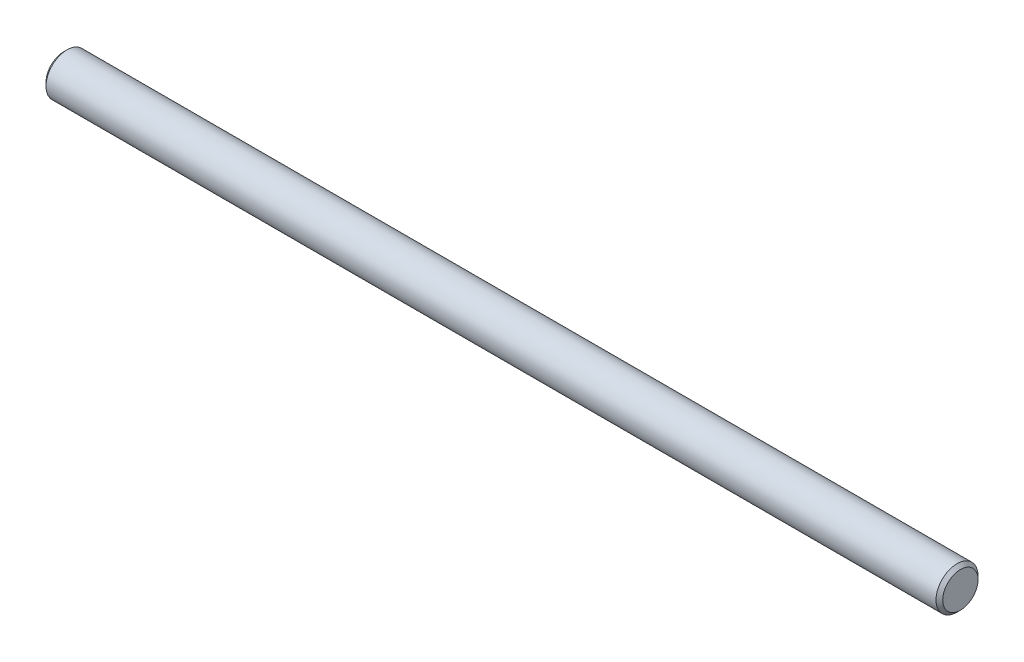
ISO-10303-21;
HEADER;
FILE_DESCRIPTION(('STEP AP214'),'2;1');
FILE_NAME('part.step','',(''),(''),'','','');
FILE_SCHEMA(('AUTOMOTIVE_DESIGN { 1 0 10303 214 1 1 1 1 }'));
ENDSEC;
DATA;
#1=APPLICATION_CONTEXT('core data for automotive mechanical design processes');
#2=APPLICATION_PROTOCOL_DEFINITION('international standard','automotive_design',2000,#1);
#3=PRODUCT_CONTEXT('',#1,'mechanical');
#4=PRODUCT('Part','Part','',(#3));
#5=PRODUCT_RELATED_PRODUCT_CATEGORY('part','',(#4));
#6=PRODUCT_DEFINITION_FORMATION('','',#4);
#7=PRODUCT_DEFINITION_CONTEXT('part definition',#1,'design');
#8=PRODUCT_DEFINITION('design','',#6,#7);
#9=PRODUCT_DEFINITION_SHAPE('','',#8);
#10=(LENGTH_UNIT() NAMED_UNIT(*) SI_UNIT(.MILLI.,.METRE.));
#11=(NAMED_UNIT(*) PLANE_ANGLE_UNIT() SI_UNIT($,.RADIAN.));
#12=(NAMED_UNIT(*) SI_UNIT($,.STERADIAN.) SOLID_ANGLE_UNIT());
#13=UNCERTAINTY_MEASURE_WITH_UNIT(LENGTH_MEASURE(1.E-05),#10,'distance_accuracy_value','');
#14=(GEOMETRIC_REPRESENTATION_CONTEXT(3) GLOBAL_UNCERTAINTY_ASSIGNED_CONTEXT((#13)) GLOBAL_UNIT_ASSIGNED_CONTEXT((#10,
#11,#12)) REPRESENTATION_CONTEXT('',''));
#15=CARTESIAN_POINT('',(0.,0.,0.));
#16=DIRECTION('',(0.,0.,1.));
#17=DIRECTION('',(1.,0.,0.));
#18=AXIS2_PLACEMENT_3D('',#15,#16,#17);
#19=CARTESIAN_POINT('',(101.6,0.,0.));
#20=DIRECTION('',(-1.,0.,0.));
#21=DIRECTION('',(0.,0.,1.));
#22=AXIS2_PLACEMENT_3D('',#19,#20,#21);
#23=CYLINDRICAL_SURFACE('',#22,2.38125);
#24=CARTESIAN_POINT('',(101.219,0.,0.));
#25=DIRECTION('',(1.,0.,0.));
#26=DIRECTION('',(0.,0.,-1.));
#27=AXIS2_PLACEMENT_3D('',#24,#25,#26);
#28=CIRCLE('',#27,2.38125);
#29=CARTESIAN_POINT('',(101.219,0.,2.38125000000001));
#30=VERTEX_POINT('',#29);
#31=EDGE_CURVE('E38',#30,#30,#28,.F.);
#32=ORIENTED_EDGE('',*,*,#31,.T.);
#33=EDGE_LOOP('',(#32));
#34=FACE_BOUND('',#33,.T.);
#35=CARTESIAN_POINT('',(0.380999999999992,0.,0.));
#36=DIRECTION('',(1.,0.,0.));
#37=DIRECTION('',(0.,0.,-1.));
#38=AXIS2_PLACEMENT_3D('',#35,#36,#37);
#39=CIRCLE('',#38,2.38125);
#40=CARTESIAN_POINT('',(0.380999999999992,0.,-2.38125));
#41=VERTEX_POINT('',#40);
#42=EDGE_CURVE('E42',#41,#41,#39,.T.);
#43=ORIENTED_EDGE('',*,*,#42,.T.);
#44=EDGE_LOOP('',(#43));
#45=FACE_BOUND('',#44,.T.);
#46=ADVANCED_FACE('F32',(#34,#45),#23,.T.);
#47=CARTESIAN_POINT('',(101.6,0.,0.));
#48=DIRECTION('',(1.,0.,0.));
#49=DIRECTION('',(0.,0.,-1.));
#50=AXIS2_PLACEMENT_3D('',#47,#48,#49);
#51=PLANE('',#50);
#52=CARTESIAN_POINT('',(101.6,0.,0.));
#53=DIRECTION('',(1.,0.,0.));
#54=DIRECTION('',(0.,0.,-1.));
#55=AXIS2_PLACEMENT_3D('',#52,#53,#54);
#56=CIRCLE('',#55,2.00024999999999);
#57=CARTESIAN_POINT('',(101.6,0.,2.00025));
#58=VERTEX_POINT('',#57);
#59=EDGE_CURVE('E46',#58,#58,#56,.T.);
#60=ORIENTED_EDGE('',*,*,#59,.T.);
#61=EDGE_LOOP('',(#60));
#62=FACE_BOUND('',#61,.T.);
#63=ADVANCED_FACE('F52',(#62),#51,.T.);
#64=CARTESIAN_POINT('',(0.,0.,0.));
#65=DIRECTION('',(1.,0.,0.));
#66=DIRECTION('',(0.,0.,-1.));
#67=AXIS2_PLACEMENT_3D('',#64,#65,#66);
#68=PLANE('',#67);
#69=CARTESIAN_POINT('',(0.,0.,0.));
#70=DIRECTION('',(1.,0.,0.));
#71=DIRECTION('',(0.,0.,-1.));
#72=AXIS2_PLACEMENT_3D('',#69,#70,#71);
#73=CIRCLE('',#72,2.00025000000001);
#74=CARTESIAN_POINT('',(0.,0.,-2.00025000000001));
#75=VERTEX_POINT('',#74);
#76=EDGE_CURVE('E10',#75,#75,#73,.F.);
#77=ORIENTED_EDGE('',*,*,#76,.T.);
#78=EDGE_LOOP('',(#77));
#79=FACE_BOUND('',#78,.T.);
#80=ADVANCED_FACE('F57',(#79),#68,.F.);
#81=CARTESIAN_POINT('',(101.6,0.,0.));
#82=DIRECTION('',(-1.,0.,0.));
#83=DIRECTION('',(0.,0.,1.));
#84=AXIS2_PLACEMENT_3D('',#81,#82,#83);
#85=CONICAL_SURFACE('',#84,2.00024999999999,0.785398163397448);
#86=CARTESIAN_POINT('',(101.219,0.,2.38125000000001));
#87=CARTESIAN_POINT('',(101.22296875,0.,2.37728125000001));
#88=CARTESIAN_POINT('',(101.2269375,0.,2.37331250000001));
#89=CARTESIAN_POINT('',(101.234875,0.,2.36537500000001));
#90=CARTESIAN_POINT('',(101.23884375,0.,2.36140625000001));
#91=CARTESIAN_POINT('',(101.24678125,0.,2.35346875000001));
#92=CARTESIAN_POINT('',(101.25075,0.,2.34950000000001));
#93=CARTESIAN_POINT('',(101.2586875,0.,2.34156250000001));
#94=CARTESIAN_POINT('',(101.26265625,0.,2.33759375000001));
#95=CARTESIAN_POINT('',(101.27059375,0.,2.32965625000001));
#96=CARTESIAN_POINT('',(101.2745625,0.,2.32568750000001));
#97=CARTESIAN_POINT('',(101.2825,0.,2.31775000000001));
#98=CARTESIAN_POINT('',(101.28646875,0.,2.31378125000001));
#99=CARTESIAN_POINT('',(101.29440625,0.,2.30584375000001));
#100=CARTESIAN_POINT('',(101.298375,0.,2.30187500000001));
#101=CARTESIAN_POINT('',(101.3063125,0.,2.29393750000001));
#102=CARTESIAN_POINT('',(101.31028125,0.,2.28996875000001));
#103=CARTESIAN_POINT('',(101.31821875,0.,2.28203125000001));
#104=CARTESIAN_POINT('',(101.3221875,0.,2.27806250000001));
#105=CARTESIAN_POINT('',(101.330125,0.,2.270125));
#106=CARTESIAN_POINT('',(101.33409375,0.,2.26615625));
#107=CARTESIAN_POINT('',(101.34203125,0.,2.25821875));
#108=CARTESIAN_POINT('',(101.346,0.,2.25425000000001));
#109=CARTESIAN_POINT('',(101.3539375,0.,2.24631250000001));
#110=CARTESIAN_POINT('',(101.35790625,0.,2.24234375));
#111=CARTESIAN_POINT('',(101.36584375,0.,2.23440625));
#112=CARTESIAN_POINT('',(101.3698125,0.,2.2304375));
#113=CARTESIAN_POINT('',(101.37775,0.,2.2225));
#114=CARTESIAN_POINT('',(101.38171875,0.,2.21853125));
#115=CARTESIAN_POINT('',(101.38965625,0.,2.21059375));
#116=CARTESIAN_POINT('',(101.393625,0.,2.206625));
#117=CARTESIAN_POINT('',(101.4015625,0.,2.1986875));
#118=CARTESIAN_POINT('',(101.40553125,0.,2.19471875));
#119=CARTESIAN_POINT('',(101.41346875,0.,2.18678125));
#120=CARTESIAN_POINT('',(101.4174375,0.,2.1828125));
#121=CARTESIAN_POINT('',(101.425375,0.,2.174875));
#122=CARTESIAN_POINT('',(101.42934375,0.,2.17090625));
#123=CARTESIAN_POINT('',(101.43728125,0.,2.16296875));
#124=CARTESIAN_POINT('',(101.44125,0.,2.159));
#125=CARTESIAN_POINT('',(101.4491875,0.,2.1510625));
#126=CARTESIAN_POINT('',(101.45315625,0.,2.14709375));
#127=CARTESIAN_POINT('',(101.46109375,0.,2.13915625));
#128=CARTESIAN_POINT('',(101.4650625,0.,2.1351875));
#129=CARTESIAN_POINT('',(101.473,0.,2.12725));
#130=CARTESIAN_POINT('',(101.47696875,0.,2.12328125));
#131=CARTESIAN_POINT('',(101.48490625,0.,2.11534375));
#132=CARTESIAN_POINT('',(101.488875,0.,2.111375));
#133=CARTESIAN_POINT('',(101.4968125,0.,2.1034375));
#134=CARTESIAN_POINT('',(101.50078125,0.,2.09946875));
#135=CARTESIAN_POINT('',(101.50871875,0.,2.09153125));
#136=CARTESIAN_POINT('',(101.5126875,0.,2.0875625));
#137=CARTESIAN_POINT('',(101.520625,0.,2.079625));
#138=CARTESIAN_POINT('',(101.52459375,0.,2.07565625));
#139=CARTESIAN_POINT('',(101.53253125,0.,2.06771875));
#140=CARTESIAN_POINT('',(101.5365,0.,2.06375));
#141=CARTESIAN_POINT('',(101.5444375,0.,2.0558125));
#142=CARTESIAN_POINT('',(101.54840625,0.,2.05184375));
#143=CARTESIAN_POINT('',(101.55634375,0.,2.04390625));
#144=CARTESIAN_POINT('',(101.5603125,0.,2.0399375));
#145=CARTESIAN_POINT('',(101.56825,0.,2.032));
#146=CARTESIAN_POINT('',(101.57221875,0.,2.02803125));
#147=CARTESIAN_POINT('',(101.58015625,0.,2.02009375));
#148=CARTESIAN_POINT('',(101.584125,0.,2.016125));
#149=CARTESIAN_POINT('',(101.5920625,0.,2.0081875));
#150=CARTESIAN_POINT('',(101.59603125,0.,2.00421875));
#151=CARTESIAN_POINT('',(101.6,0.,2.00025));
#152=B_SPLINE_CURVE_WITH_KNOTS('',3,(#86,#87,#88,#89,#90,#91,#92,#93,#94,#95,#96,#97,#98,#99,
#100,#101,#102,#103,#104,#105,#106,#107,#108,#109,#110,#111,#112,#113,#114,#115,#116,#117,#118,
#119,#120,#121,#122,#123,#124,#125,#126,#127,#128,#129,#130,#131,#132,#133,#134,#135,#136,#137,
#138,#139,#140,#141,#142,#143,#144,#145,#146,#147,#148,#149,#150,#151),.UNSPECIFIED.,.F.,.F.,(4,
2,2,2,2,2,2,2,2,2,2,2,2,2,2,2,2,2,2,2,2,2,2,2,2,2,2,2,2,2,2,2,4),(0.,0.016837980227004,
0.033675960454008,0.0505139406810121,0.0673519209080161,0.0841899011350201,0.101027881362024,
0.117865861589028,0.134703841816032,0.151541822043036,0.16837980227004,0.185217782497054,
0.202055762724058,0.218893742951062,0.235731723178066,0.25256970340507,0.269407683632074,
0.286245663859078,0.303083644086082,0.319921624313086,0.33675960454009,0.353597584767094,
0.370435564994108,0.387273545221112,0.404111525448116,0.42094950567512,0.437787485902124,
0.454625466129128,0.471463446356132,0.488301426583136,0.50513940681014,0.521977387037144,
0.538815367264158),.UNSPECIFIED.);
#153=EDGE_CURVE('BSEAM54',#30,#58,#152,.T.);
#154=ORIENTED_EDGE('',*,*,#31,.F.);
#155=ORIENTED_EDGE('',*,*,#59,.F.);
#156=ORIENTED_EDGE('',*,*,#153,.T.);
#157=ORIENTED_EDGE('',*,*,#153,.F.);
#158=EDGE_LOOP('',(#154,#156,#155,#157));
#159=FACE_BOUND('',#158,.T.);
#160=ADVANCED_FACE('F54',(#159),#85,.T.);
#161=CARTESIAN_POINT('',(0.380999999999992,0.,0.));
#162=DIRECTION('',(1.,0.,0.));
#163=DIRECTION('',(0.,0.,-1.));
#164=AXIS2_PLACEMENT_3D('',#161,#162,#163);
#165=CONICAL_SURFACE('',#164,2.38125,0.785398163397449);
#166=ORIENTED_EDGE('',*,*,#76,.F.);
#167=EDGE_LOOP('',(#166));
#168=FACE_BOUND('',#167,.T.);
#169=ORIENTED_EDGE('',*,*,#42,.F.);
#170=EDGE_LOOP('',(#169));
#171=FACE_BOUND('',#170,.T.);
#172=ADVANCED_FACE('F56',(#168,#171),#165,.T.);
#173=CLOSED_SHELL('',(#46,#63,#80,#160,#172));
#174=MANIFOLD_SOLID_BREP('B2',#173);
#175=ADVANCED_BREP_SHAPE_REPRESENTATION('',(#18,#174),#14);
#176=SHAPE_DEFINITION_REPRESENTATION(#9,#175);
ENDSEC;
END-ISO-10303-21;
